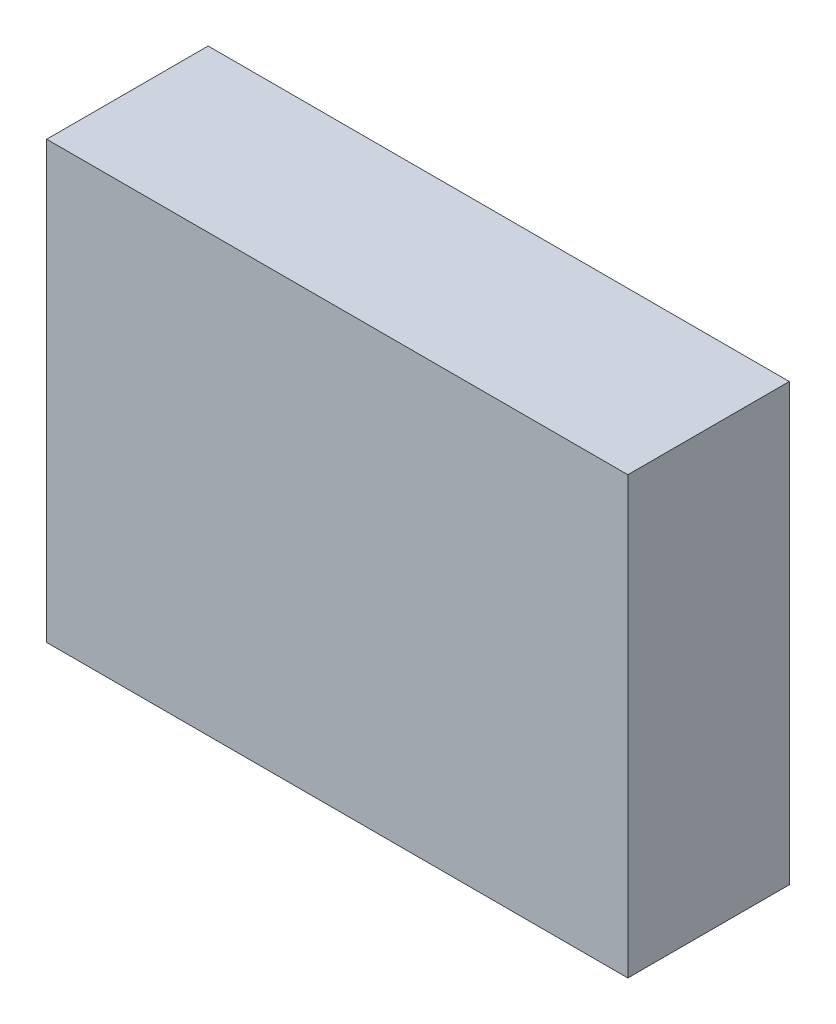
ISO-10303-21;
HEADER;
FILE_DESCRIPTION(('STEP AP214'),'2;1');
FILE_NAME('part.step','',(''),(''),'','','');
FILE_SCHEMA(('AUTOMOTIVE_DESIGN { 1 0 10303 214 1 1 1 1 }'));
ENDSEC;
DATA;
#1=APPLICATION_CONTEXT('core data for automotive mechanical design processes');
#2=APPLICATION_PROTOCOL_DEFINITION('international standard','automotive_design',2000,#1);
#3=PRODUCT_CONTEXT('',#1,'mechanical');
#4=PRODUCT('Part','Part','',(#3));
#5=PRODUCT_RELATED_PRODUCT_CATEGORY('part','',(#4));
#6=PRODUCT_DEFINITION_FORMATION('','',#4);
#7=PRODUCT_DEFINITION_CONTEXT('part definition',#1,'design');
#8=PRODUCT_DEFINITION('design','',#6,#7);
#9=PRODUCT_DEFINITION_SHAPE('','',#8);
#10=(LENGTH_UNIT() NAMED_UNIT(*) SI_UNIT(.MILLI.,.METRE.));
#11=(NAMED_UNIT(*) PLANE_ANGLE_UNIT() SI_UNIT($,.RADIAN.));
#12=(NAMED_UNIT(*) SI_UNIT($,.STERADIAN.) SOLID_ANGLE_UNIT());
#13=UNCERTAINTY_MEASURE_WITH_UNIT(LENGTH_MEASURE(1.E-05),#10,'distance_accuracy_value','');
#14=(GEOMETRIC_REPRESENTATION_CONTEXT(3) GLOBAL_UNCERTAINTY_ASSIGNED_CONTEXT((#13)) GLOBAL_UNIT_ASSIGNED_CONTEXT((#10,
#11,#12)) REPRESENTATION_CONTEXT('',''));
#15=CARTESIAN_POINT('',(0.,0.,0.));
#16=DIRECTION('',(0.,0.,1.));
#17=DIRECTION('',(1.,0.,0.));
#18=AXIS2_PLACEMENT_3D('',#15,#16,#17);
#19=CARTESIAN_POINT('',(0.,0.,25.4));
#20=DIRECTION('',(1.,0.,0.));
#21=DIRECTION('',(0.,0.,-1.));
#22=AXIS2_PLACEMENT_3D('',#19,#20,#21);
#23=PLANE('',#22);
#24=DIRECTION('',(0.,-1.,0.));
#25=VECTOR('',#24,1.);
#26=CARTESIAN_POINT('',(0.,0.,0.));
#27=LINE('',#26,#25);
#28=CARTESIAN_POINT('',(0.,68.58,0.));
#29=VERTEX_POINT('',#28);
#30=CARTESIAN_POINT('',(0.,0.,0.));
#31=VERTEX_POINT('',#30);
#32=EDGE_CURVE('E96',#29,#31,#27,.T.);
#33=ORIENTED_EDGE('',*,*,#32,.T.);
#34=DIRECTION('',(0.,0.,-1.));
#35=VECTOR('',#34,1.);
#36=CARTESIAN_POINT('',(0.,0.,25.4));
#37=LINE('',#36,#35);
#38=CARTESIAN_POINT('',(0.,0.,25.4));
#39=VERTEX_POINT('',#38);
#40=EDGE_CURVE('E11',#39,#31,#37,.T.);
#41=ORIENTED_EDGE('',*,*,#40,.F.);
#42=DIRECTION('',(0.,-1.,0.));
#43=VECTOR('',#42,1.);
#44=CARTESIAN_POINT('',(0.,0.,25.4));
#45=LINE('',#44,#43);
#46=CARTESIAN_POINT('',(0.,68.58,25.4));
#47=VERTEX_POINT('',#46);
#48=EDGE_CURVE('E84',#47,#39,#45,.T.);
#49=ORIENTED_EDGE('',*,*,#48,.F.);
#50=DIRECTION('',(0.,0.,-1.));
#51=VECTOR('',#50,1.);
#52=CARTESIAN_POINT('',(0.,68.58,25.4));
#53=LINE('',#52,#51);
#54=EDGE_CURVE('E92',#47,#29,#53,.T.);
#55=ORIENTED_EDGE('',*,*,#54,.T.);
#56=EDGE_LOOP('',(#33,#41,#49,#55));
#57=FACE_BOUND('',#56,.T.);
#58=ADVANCED_FACE('F33',(#57),#23,.F.);
#59=CARTESIAN_POINT('',(0.,0.,25.4));
#60=DIRECTION('',(0.,1.,0.));
#61=DIRECTION('',(0.,0.,1.));
#62=AXIS2_PLACEMENT_3D('',#59,#60,#61);
#63=PLANE('',#62);
#64=DIRECTION('',(1.,0.,0.));
#65=VECTOR('',#64,1.);
#66=CARTESIAN_POINT('',(0.,0.,0.));
#67=LINE('',#66,#65);
#68=CARTESIAN_POINT('',(91.44,0.,0.));
#69=VERTEX_POINT('',#68);
#70=EDGE_CURVE('E88',#31,#69,#67,.T.);
#71=ORIENTED_EDGE('',*,*,#70,.T.);
#72=DIRECTION('',(0.,0.,-1.));
#73=VECTOR('',#72,1.);
#74=CARTESIAN_POINT('',(91.44,0.,25.4));
#75=LINE('',#74,#73);
#76=CARTESIAN_POINT('',(91.44,0.,25.4));
#77=VERTEX_POINT('',#76);
#78=EDGE_CURVE('E41',#77,#69,#75,.T.);
#79=ORIENTED_EDGE('',*,*,#78,.F.);
#80=DIRECTION('',(1.,0.,0.));
#81=VECTOR('',#80,1.);
#82=CARTESIAN_POINT('',(0.,0.,25.4));
#83=LINE('',#82,#81);
#84=EDGE_CURVE('E79',#39,#77,#83,.T.);
#85=ORIENTED_EDGE('',*,*,#84,.F.);
#86=ORIENTED_EDGE('',*,*,#40,.T.);
#87=EDGE_LOOP('',(#71,#79,#85,#86));
#88=FACE_BOUND('',#87,.T.);
#89=ADVANCED_FACE('F87',(#88),#63,.F.);
#90=CARTESIAN_POINT('',(91.44,0.,25.4));
#91=DIRECTION('',(-1.,0.,0.));
#92=DIRECTION('',(0.,0.,1.));
#93=AXIS2_PLACEMENT_3D('',#90,#91,#92);
#94=PLANE('',#93);
#95=DIRECTION('',(0.,1.,0.));
#96=VECTOR('',#95,1.);
#97=CARTESIAN_POINT('',(91.44,0.,0.));
#98=LINE('',#97,#96);
#99=CARTESIAN_POINT('',(91.44,68.58,0.));
#100=VERTEX_POINT('',#99);
#101=EDGE_CURVE('E66',#69,#100,#98,.T.);
#102=ORIENTED_EDGE('',*,*,#101,.T.);
#103=DIRECTION('',(0.,0.,-1.));
#104=VECTOR('',#103,1.);
#105=CARTESIAN_POINT('',(91.44,68.58,25.4));
#106=LINE('',#105,#104);
#107=CARTESIAN_POINT('',(91.44,68.58,25.4));
#108=VERTEX_POINT('',#107);
#109=EDGE_CURVE('E89',#108,#100,#106,.T.);
#110=ORIENTED_EDGE('',*,*,#109,.F.);
#111=DIRECTION('',(0.,1.,0.));
#112=VECTOR('',#111,1.);
#113=CARTESIAN_POINT('',(91.44,0.,25.4));
#114=LINE('',#113,#112);
#115=EDGE_CURVE('E82',#77,#108,#114,.T.);
#116=ORIENTED_EDGE('',*,*,#115,.F.);
#117=ORIENTED_EDGE('',*,*,#78,.T.);
#118=EDGE_LOOP('',(#102,#110,#116,#117));
#119=FACE_BOUND('',#118,.T.);
#120=ADVANCED_FACE('F90',(#119),#94,.F.);
#121=CARTESIAN_POINT('',(0.,68.58,25.4));
#122=DIRECTION('',(0.,-1.,0.));
#123=DIRECTION('',(0.,0.,-1.));
#124=AXIS2_PLACEMENT_3D('',#121,#122,#123);
#125=PLANE('',#124);
#126=DIRECTION('',(-1.,0.,0.));
#127=VECTOR('',#126,1.);
#128=CARTESIAN_POINT('',(0.,68.58,0.));
#129=LINE('',#128,#127);
#130=EDGE_CURVE('E72',#100,#29,#129,.T.);
#131=ORIENTED_EDGE('',*,*,#130,.T.);
#132=ORIENTED_EDGE('',*,*,#54,.F.);
#133=DIRECTION('',(-1.,0.,0.));
#134=VECTOR('',#133,1.);
#135=CARTESIAN_POINT('',(0.,68.58,25.4));
#136=LINE('',#135,#134);
#137=EDGE_CURVE('E49',#108,#47,#136,.T.);
#138=ORIENTED_EDGE('',*,*,#137,.F.);
#139=ORIENTED_EDGE('',*,*,#109,.T.);
#140=EDGE_LOOP('',(#131,#132,#138,#139));
#141=FACE_BOUND('',#140,.T.);
#142=ADVANCED_FACE('F103',(#141),#125,.F.);
#143=CARTESIAN_POINT('',(0.,0.,25.4));
#144=DIRECTION('',(0.,0.,-1.));
#145=DIRECTION('',(-1.,0.,0.));
#146=AXIS2_PLACEMENT_3D('',#143,#144,#145);
#147=PLANE('',#146);
#148=ORIENTED_EDGE('',*,*,#48,.T.);
#149=ORIENTED_EDGE('',*,*,#84,.T.);
#150=ORIENTED_EDGE('',*,*,#115,.T.);
#151=ORIENTED_EDGE('',*,*,#137,.T.);
#152=EDGE_LOOP('',(#148,#149,#150,#151));
#153=FACE_BOUND('',#152,.T.);
#154=ADVANCED_FACE('F80',(#153),#147,.F.);
#155=CARTESIAN_POINT('',(0.,0.,0.));
#156=DIRECTION('',(0.,0.,-1.));
#157=DIRECTION('',(-1.,0.,0.));
#158=AXIS2_PLACEMENT_3D('',#155,#156,#157);
#159=PLANE('',#158);
#160=ORIENTED_EDGE('',*,*,#32,.F.);
#161=ORIENTED_EDGE('',*,*,#130,.F.);
#162=ORIENTED_EDGE('',*,*,#101,.F.);
#163=ORIENTED_EDGE('',*,*,#70,.F.);
#164=EDGE_LOOP('',(#160,#161,#162,#163));
#165=FACE_BOUND('',#164,.T.);
#166=ADVANCED_FACE('F106',(#165),#159,.T.);
#167=CLOSED_SHELL('',(#58,#89,#120,#142,#154,#166));
#168=MANIFOLD_SOLID_BREP('B2',#167);
#169=ADVANCED_BREP_SHAPE_REPRESENTATION('',(#18,#168),#14);
#170=SHAPE_DEFINITION_REPRESENTATION(#9,#169);
ENDSEC;
END-ISO-10303-21;
